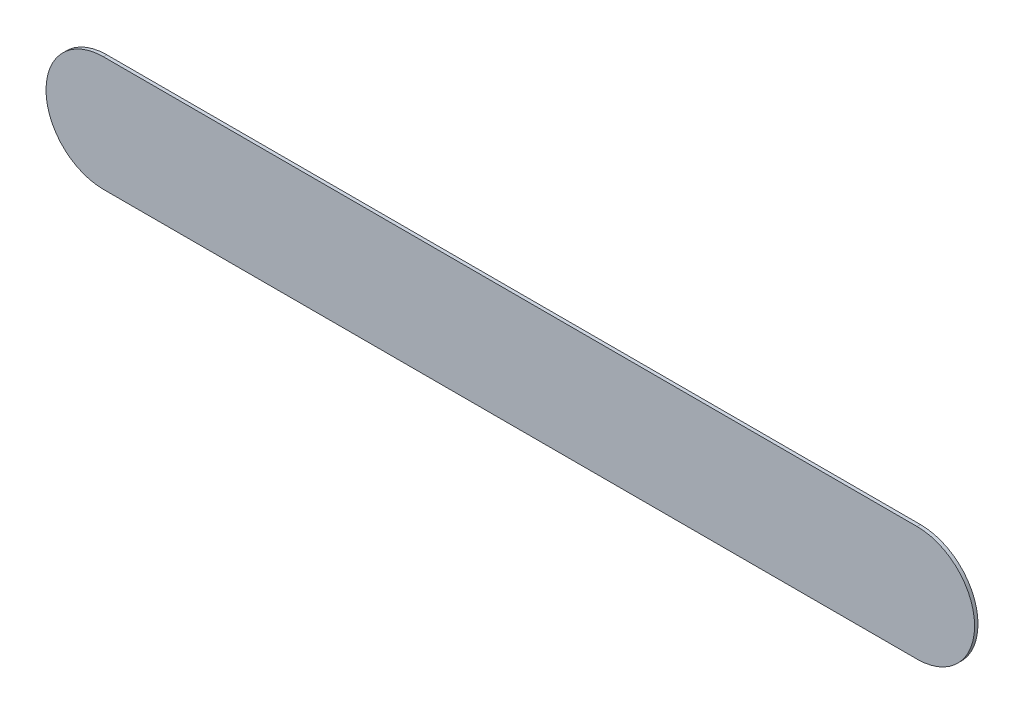
ISO-10303-21;
HEADER;
FILE_DESCRIPTION(('STEP AP214'),'2;1');
FILE_NAME('part.step','',(''),(''),'','','');
FILE_SCHEMA(('AUTOMOTIVE_DESIGN { 1 0 10303 214 1 1 1 1 }'));
ENDSEC;
DATA;
#1=APPLICATION_CONTEXT('core data for automotive mechanical design processes');
#2=APPLICATION_PROTOCOL_DEFINITION('international standard','automotive_design',2000,#1);
#3=PRODUCT_CONTEXT('',#1,'mechanical');
#4=PRODUCT('Part','Part','',(#3));
#5=PRODUCT_RELATED_PRODUCT_CATEGORY('part','',(#4));
#6=PRODUCT_DEFINITION_FORMATION('','',#4);
#7=PRODUCT_DEFINITION_CONTEXT('part definition',#1,'design');
#8=PRODUCT_DEFINITION('design','',#6,#7);
#9=PRODUCT_DEFINITION_SHAPE('','',#8);
#10=(LENGTH_UNIT() NAMED_UNIT(*) SI_UNIT(.MILLI.,.METRE.));
#11=(NAMED_UNIT(*) PLANE_ANGLE_UNIT() SI_UNIT($,.RADIAN.));
#12=(NAMED_UNIT(*) SI_UNIT($,.STERADIAN.) SOLID_ANGLE_UNIT());
#13=UNCERTAINTY_MEASURE_WITH_UNIT(LENGTH_MEASURE(1.E-05),#10,'distance_accuracy_value','');
#14=(GEOMETRIC_REPRESENTATION_CONTEXT(3) GLOBAL_UNCERTAINTY_ASSIGNED_CONTEXT((#13)) GLOBAL_UNIT_ASSIGNED_CONTEXT((#10,
#11,#12)) REPRESENTATION_CONTEXT('',''));
#15=CARTESIAN_POINT('',(0.,0.,0.));
#16=DIRECTION('',(0.,0.,1.));
#17=DIRECTION('',(1.,0.,0.));
#18=AXIS2_PLACEMENT_3D('',#15,#16,#17);
#19=CARTESIAN_POINT('',(41.4000188,119.8999888,0.));
#20=DIRECTION('',(0.,1.,0.));
#21=DIRECTION('',(1.,0.,0.));
#22=AXIS2_PLACEMENT_3D('',#19,#20,#21);
#23=PLANE('',#22);
#24=DIRECTION('',(1.,0.,0.));
#25=VECTOR('',#24,1.);
#26=CARTESIAN_POINT('',(41.4000188,119.8999888,0.03556));
#27=LINE('',#26,#25);
#28=CARTESIAN_POINT('',(41.4000188,119.8999888,0.03556));
#29=VERTEX_POINT('',#28);
#30=CARTESIAN_POINT('',(49.9000272,119.8999888,0.03556));
#31=VERTEX_POINT('',#30);
#32=EDGE_CURVE('E11',#29,#31,#27,.T.);
#33=ORIENTED_EDGE('',*,*,#32,.F.);
#34=DIRECTION('',(0.,0.,1.));
#35=VECTOR('',#34,1.);
#36=CARTESIAN_POINT('',(41.4000188,119.8999888,0.));
#37=LINE('',#36,#35);
#38=CARTESIAN_POINT('',(41.4000188,119.8999888,0.));
#39=VERTEX_POINT('',#38);
#40=EDGE_CURVE('E24',#39,#29,#37,.T.);
#41=ORIENTED_EDGE('',*,*,#40,.F.);
#42=DIRECTION('',(1.,0.,0.));
#43=VECTOR('',#42,1.);
#44=CARTESIAN_POINT('',(41.4000188,119.8999888,0.));
#45=LINE('',#44,#43);
#46=CARTESIAN_POINT('',(49.9000272,119.8999888,0.));
#47=VERTEX_POINT('',#46);
#48=EDGE_CURVE('E75',#39,#47,#45,.T.);
#49=ORIENTED_EDGE('',*,*,#48,.T.);
#50=DIRECTION('',(0.,0.,1.));
#51=VECTOR('',#50,1.);
#52=CARTESIAN_POINT('',(49.9000272,119.8999888,0.));
#53=LINE('',#52,#51);
#54=EDGE_CURVE('E37',#47,#31,#53,.T.);
#55=ORIENTED_EDGE('',*,*,#54,.T.);
#56=EDGE_LOOP('',(#33,#41,#49,#55));
#57=FACE_BOUND('',#56,.T.);
#58=ADVANCED_FACE('F17',(#57),#23,.F.);
#59=CARTESIAN_POINT('',(49.9000272,120.4999876,0.));
#60=DIRECTION('',(0.,0.,-1.));
#61=DIRECTION('',(0.,-1.,0.));
#62=AXIS2_PLACEMENT_3D('',#59,#60,#61);
#63=CYLINDRICAL_SURFACE('',#62,0.599998799999999);
#64=CARTESIAN_POINT('',(49.9000272,120.4999876,0.03556));
#65=DIRECTION('',(0.,0.,1.));
#66=DIRECTION('',(0.,-1.,0.));
#67=AXIS2_PLACEMENT_3D('',#64,#65,#66);
#68=CIRCLE('',#67,0.599998799999999);
#69=CARTESIAN_POINT('',(49.9000272,121.0999864,0.03556));
#70=VERTEX_POINT('',#69);
#71=EDGE_CURVE('E83',#31,#70,#68,.T.);
#72=ORIENTED_EDGE('',*,*,#71,.F.);
#73=ORIENTED_EDGE('',*,*,#54,.F.);
#74=CARTESIAN_POINT('',(49.9000272,120.4999876,0.));
#75=DIRECTION('',(0.,0.,1.));
#76=DIRECTION('',(0.,-1.,0.));
#77=AXIS2_PLACEMENT_3D('',#74,#75,#76);
#78=CIRCLE('',#77,0.599998799999999);
#79=CARTESIAN_POINT('',(49.9000272,121.0999864,0.));
#80=VERTEX_POINT('',#79);
#81=EDGE_CURVE('E81',#47,#80,#78,.T.);
#82=ORIENTED_EDGE('',*,*,#81,.T.);
#83=DIRECTION('',(0.,0.,1.));
#84=VECTOR('',#83,1.);
#85=CARTESIAN_POINT('',(49.9000272,121.0999864,0.));
#86=LINE('',#85,#84);
#87=EDGE_CURVE('E67',#80,#70,#86,.T.);
#88=ORIENTED_EDGE('',*,*,#87,.T.);
#89=EDGE_LOOP('',(#72,#73,#82,#88));
#90=FACE_BOUND('',#89,.T.);
#91=ADVANCED_FACE('F89',(#90),#63,.T.);
#92=CARTESIAN_POINT('',(49.9000272,121.0999864,0.));
#93=DIRECTION('',(0.,-1.,0.));
#94=DIRECTION('',(-1.,0.,0.));
#95=AXIS2_PLACEMENT_3D('',#92,#93,#94);
#96=PLANE('',#95);
#97=DIRECTION('',(-1.,0.,0.));
#98=VECTOR('',#97,1.);
#99=CARTESIAN_POINT('',(49.9000272,121.0999864,0.03556));
#100=LINE('',#99,#98);
#101=CARTESIAN_POINT('',(41.4000188,121.0999864,0.03556));
#102=VERTEX_POINT('',#101);
#103=EDGE_CURVE('E71',#70,#102,#100,.T.);
#104=ORIENTED_EDGE('',*,*,#103,.F.);
#105=ORIENTED_EDGE('',*,*,#87,.F.);
#106=DIRECTION('',(-1.,0.,0.));
#107=VECTOR('',#106,1.);
#108=CARTESIAN_POINT('',(49.9000272,121.0999864,0.));
#109=LINE('',#108,#107);
#110=CARTESIAN_POINT('',(41.4000188,121.0999864,0.));
#111=VERTEX_POINT('',#110);
#112=EDGE_CURVE('E63',#80,#111,#109,.T.);
#113=ORIENTED_EDGE('',*,*,#112,.T.);
#114=DIRECTION('',(0.,0.,1.));
#115=VECTOR('',#114,1.);
#116=CARTESIAN_POINT('',(41.4000188,121.0999864,0.));
#117=LINE('',#116,#115);
#118=EDGE_CURVE('E53',#111,#102,#117,.T.);
#119=ORIENTED_EDGE('',*,*,#118,.T.);
#120=EDGE_LOOP('',(#104,#105,#113,#119));
#121=FACE_BOUND('',#120,.T.);
#122=ADVANCED_FACE('F66',(#121),#96,.F.);
#123=CARTESIAN_POINT('',(41.4000188,120.4999876,0.));
#124=DIRECTION('',(0.,0.,-1.));
#125=DIRECTION('',(0.,1.,0.));
#126=AXIS2_PLACEMENT_3D('',#123,#124,#125);
#127=CYLINDRICAL_SURFACE('',#126,0.599998800000002);
#128=CARTESIAN_POINT('',(41.4000188,120.4999876,0.03556));
#129=DIRECTION('',(0.,0.,1.));
#130=DIRECTION('',(0.,1.,0.));
#131=AXIS2_PLACEMENT_3D('',#128,#129,#130);
#132=CIRCLE('',#131,0.599998800000002);
#133=EDGE_CURVE('E59',#102,#29,#132,.T.);
#134=ORIENTED_EDGE('',*,*,#133,.F.);
#135=ORIENTED_EDGE('',*,*,#118,.F.);
#136=CARTESIAN_POINT('',(41.4000188,120.4999876,0.));
#137=DIRECTION('',(0.,0.,1.));
#138=DIRECTION('',(0.,1.,0.));
#139=AXIS2_PLACEMENT_3D('',#136,#137,#138);
#140=CIRCLE('',#139,0.599998800000002);
#141=EDGE_CURVE('E57',#111,#39,#140,.T.);
#142=ORIENTED_EDGE('',*,*,#141,.T.);
#143=ORIENTED_EDGE('',*,*,#40,.T.);
#144=EDGE_LOOP('',(#134,#135,#142,#143));
#145=FACE_BOUND('',#144,.T.);
#146=ADVANCED_FACE('F55',(#145),#127,.T.);
#147=CARTESIAN_POINT('',(41.4000188,119.8999888,0.));
#148=DIRECTION('',(0.,0.,-1.));
#149=DIRECTION('',(-1.,0.,0.));
#150=AXIS2_PLACEMENT_3D('',#147,#148,#149);
#151=PLANE('',#150);
#152=ORIENTED_EDGE('',*,*,#141,.F.);
#153=ORIENTED_EDGE('',*,*,#112,.F.);
#154=ORIENTED_EDGE('',*,*,#81,.F.);
#155=ORIENTED_EDGE('',*,*,#48,.F.);
#156=EDGE_LOOP('',(#152,#153,#154,#155));
#157=FACE_BOUND('',#156,.T.);
#158=ADVANCED_FACE('F74',(#157),#151,.T.);
#159=CARTESIAN_POINT('',(41.4000188,119.8999888,0.03556));
#160=DIRECTION('',(0.,0.,-1.));
#161=DIRECTION('',(-1.,0.,0.));
#162=AXIS2_PLACEMENT_3D('',#159,#160,#161);
#163=PLANE('',#162);
#164=ORIENTED_EDGE('',*,*,#32,.T.);
#165=ORIENTED_EDGE('',*,*,#71,.T.);
#166=ORIENTED_EDGE('',*,*,#103,.T.);
#167=ORIENTED_EDGE('',*,*,#133,.T.);
#168=EDGE_LOOP('',(#164,#165,#166,#167));
#169=FACE_BOUND('',#168,.T.);
#170=ADVANCED_FACE('F91',(#169),#163,.F.);
#171=CLOSED_SHELL('',(#58,#91,#122,#146,#158,#170));
#172=MANIFOLD_SOLID_BREP('B1',#171);
#173=ADVANCED_BREP_SHAPE_REPRESENTATION('',(#18,#172),#14);
#174=SHAPE_DEFINITION_REPRESENTATION(#9,#173);
ENDSEC;
END-ISO-10303-21;
